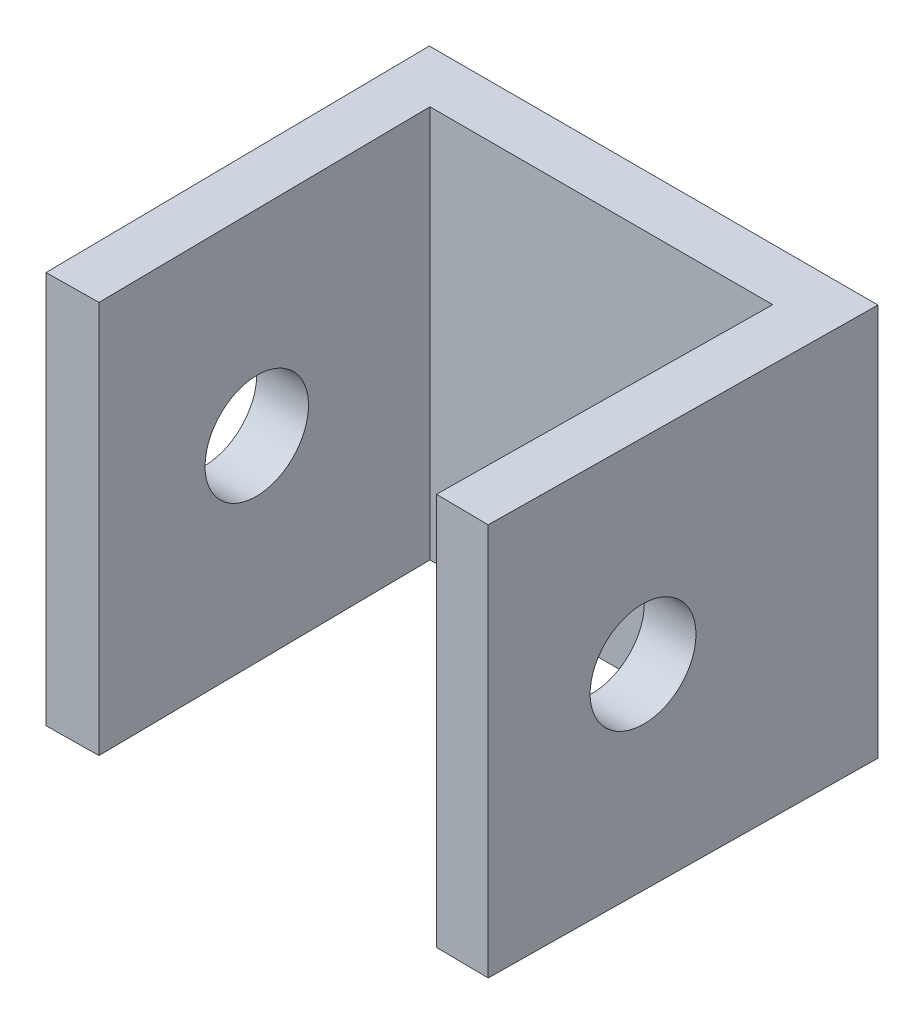
ISO-10303-21;
HEADER;
FILE_DESCRIPTION(('STEP AP214'),'2;1');
FILE_NAME('part.step','',(''),(''),'','','');
FILE_SCHEMA(('AUTOMOTIVE_DESIGN { 1 0 10303 214 1 1 1 1 }'));
ENDSEC;
DATA;
#1=APPLICATION_CONTEXT('core data for automotive mechanical design processes');
#2=APPLICATION_PROTOCOL_DEFINITION('international standard','automotive_design',2000,#1);
#3=PRODUCT_CONTEXT('',#1,'mechanical');
#4=PRODUCT('Part','Part','',(#3));
#5=PRODUCT_RELATED_PRODUCT_CATEGORY('part','',(#4));
#6=PRODUCT_DEFINITION_FORMATION('','',#4);
#7=PRODUCT_DEFINITION_CONTEXT('part definition',#1,'design');
#8=PRODUCT_DEFINITION('design','',#6,#7);
#9=PRODUCT_DEFINITION_SHAPE('','',#8);
#10=(LENGTH_UNIT() NAMED_UNIT(*) SI_UNIT(.MILLI.,.METRE.));
#11=(NAMED_UNIT(*) PLANE_ANGLE_UNIT() SI_UNIT($,.RADIAN.));
#12=(NAMED_UNIT(*) SI_UNIT($,.STERADIAN.) SOLID_ANGLE_UNIT());
#13=UNCERTAINTY_MEASURE_WITH_UNIT(LENGTH_MEASURE(1.E-05),#10,'distance_accuracy_value','');
#14=(GEOMETRIC_REPRESENTATION_CONTEXT(3) GLOBAL_UNCERTAINTY_ASSIGNED_CONTEXT((#13)) GLOBAL_UNIT_ASSIGNED_CONTEXT((#10,
#11,#12)) REPRESENTATION_CONTEXT('',''));
#15=CARTESIAN_POINT('',(0.,0.,0.));
#16=DIRECTION('',(0.,0.,1.));
#17=DIRECTION('',(1.,0.,0.));
#18=AXIS2_PLACEMENT_3D('',#15,#16,#17);
#19=CARTESIAN_POINT('',(0.,30.,0.));
#20=DIRECTION('',(0.,1.,0.));
#21=DIRECTION('',(0.,0.,1.));
#22=AXIS2_PLACEMENT_3D('',#19,#20,#21);
#23=PLANE('',#22);
#24=DIRECTION('',(-1.,0.,0.));
#25=VECTOR('',#24,1.);
#26=CARTESIAN_POINT('',(-17.1471496487741,30.,-16.8));
#27=LINE('',#26,#25);
#28=CARTESIAN_POINT('',(17.1475230853167,30.,-16.8));
#29=VERTEX_POINT('',#28);
#30=CARTESIAN_POINT('',(-17.1471496487741,30.,-16.8));
#31=VERTEX_POINT('',#30);
#32=EDGE_CURVE('E120',#29,#31,#27,.T.);
#33=ORIENTED_EDGE('',*,*,#32,.T.);
#34=DIRECTION('',(0.0117179454201639,0.,0.99993134252064));
#35=VECTOR('',#34,1.);
#36=CARTESIAN_POINT('',(-16.7997253700826,30.,12.8468717816807));
#37=LINE('',#36,#35);
#38=CARTESIAN_POINT('',(-16.7997253700826,30.,12.8468717816807));
#39=VERTEX_POINT('',#38);
#40=EDGE_CURVE('E51',#31,#39,#37,.T.);
#41=ORIENTED_EDGE('',*,*,#40,.T.);
#42=DIRECTION('',(0.999931342520641,0.,-0.0117179454201641));
#43=VECTOR('',#42,1.);
#44=CARTESIAN_POINT('',(-16.7997253700826,30.,12.8468717816807));
#45=LINE('',#44,#43);
#46=CARTESIAN_POINT('',(-12.8,30.,12.8));
#47=VERTEX_POINT('',#46);
#48=EDGE_CURVE('E144',#39,#47,#45,.T.);
#49=ORIENTED_EDGE('',*,*,#48,.T.);
#50=DIRECTION('',(-0.0117179454201639,0.,-0.99993134252064));
#51=VECTOR('',#50,1.);
#52=CARTESIAN_POINT('',(-12.8,30.,12.8));
#53=LINE('',#52,#51);
#54=CARTESIAN_POINT('',(-13.1,30.,-12.8));
#55=VERTEX_POINT('',#54);
#56=EDGE_CURVE('E91',#47,#55,#53,.T.);
#57=ORIENTED_EDGE('',*,*,#56,.T.);
#58=DIRECTION('',(1.,0.,0.));
#59=VECTOR('',#58,1.);
#60=CARTESIAN_POINT('',(-13.1,30.,-12.8));
#61=LINE('',#60,#59);
#62=CARTESIAN_POINT('',(13.1,30.,-12.8));
#63=VERTEX_POINT('',#62);
#64=EDGE_CURVE('E160',#55,#63,#61,.T.);
#65=ORIENTED_EDGE('',*,*,#64,.T.);
#66=DIRECTION('',(-0.0118101998876842,0.,0.999930257157274));
#67=VECTOR('',#66,1.);
#68=CARTESIAN_POINT('',(13.1,30.,-12.8));
#69=LINE('',#68,#67);
#70=CARTESIAN_POINT('',(12.8,30.,12.6));
#71=VERTEX_POINT('',#70);
#72=EDGE_CURVE('E106',#63,#71,#69,.T.);
#73=ORIENTED_EDGE('',*,*,#72,.T.);
#74=DIRECTION('',(0.999930257157274,0.,0.0118101998876842));
#75=VECTOR('',#74,1.);
#76=CARTESIAN_POINT('',(12.8,30.,12.6));
#77=LINE('',#76,#75);
#78=CARTESIAN_POINT('',(16.7997210286291,30.,12.6472407995507));
#79=VERTEX_POINT('',#78);
#80=EDGE_CURVE('E101',#71,#79,#77,.T.);
#81=ORIENTED_EDGE('',*,*,#80,.T.);
#82=DIRECTION('',(0.0118101998876842,0.,-0.999930257157274));
#83=VECTOR('',#82,1.);
#84=CARTESIAN_POINT('',(17.1475230853167,30.,-16.8));
#85=LINE('',#84,#83);
#86=EDGE_CURVE('E104',#79,#29,#85,.T.);
#87=ORIENTED_EDGE('',*,*,#86,.T.);
#88=EDGE_LOOP('',(#33,#41,#49,#57,#65,#73,#81,#87));
#89=FACE_BOUND('',#88,.T.);
#90=ADVANCED_FACE('F33',(#89),#23,.T.);
#91=CARTESIAN_POINT('',(0.,0.,0.));
#92=DIRECTION('',(0.,1.,0.));
#93=DIRECTION('',(0.,0.,1.));
#94=AXIS2_PLACEMENT_3D('',#91,#92,#93);
#95=PLANE('',#94);
#96=DIRECTION('',(0.999930257157274,0.,0.0118101998876842));
#97=VECTOR('',#96,1.);
#98=CARTESIAN_POINT('',(12.8,0.,12.6));
#99=LINE('',#98,#97);
#100=CARTESIAN_POINT('',(12.8,0.,12.6));
#101=VERTEX_POINT('',#100);
#102=CARTESIAN_POINT('',(16.7997210286291,0.,12.6472407995507));
#103=VERTEX_POINT('',#102);
#104=EDGE_CURVE('E114',#101,#103,#99,.T.);
#105=ORIENTED_EDGE('',*,*,#104,.F.);
#106=DIRECTION('',(-0.0118101998876842,0.,0.999930257157274));
#107=VECTOR('',#106,1.);
#108=CARTESIAN_POINT('',(13.1,0.,-12.8));
#109=LINE('',#108,#107);
#110=CARTESIAN_POINT('',(13.1,0.,-12.8));
#111=VERTEX_POINT('',#110);
#112=EDGE_CURVE('E136',#111,#101,#109,.T.);
#113=ORIENTED_EDGE('',*,*,#112,.F.);
#114=DIRECTION('',(1.,0.,0.));
#115=VECTOR('',#114,1.);
#116=CARTESIAN_POINT('',(-13.1,0.,-12.8));
#117=LINE('',#116,#115);
#118=CARTESIAN_POINT('',(-13.1,0.,-12.8));
#119=VERTEX_POINT('',#118);
#120=EDGE_CURVE('E134',#119,#111,#117,.T.);
#121=ORIENTED_EDGE('',*,*,#120,.F.);
#122=DIRECTION('',(-0.0117179454201639,0.,-0.99993134252064));
#123=VECTOR('',#122,1.);
#124=CARTESIAN_POINT('',(-12.8,0.,12.8));
#125=LINE('',#124,#123);
#126=CARTESIAN_POINT('',(-12.8,0.,12.8));
#127=VERTEX_POINT('',#126);
#128=EDGE_CURVE('E130',#127,#119,#125,.T.);
#129=ORIENTED_EDGE('',*,*,#128,.F.);
#130=DIRECTION('',(0.999931342520641,0.,-0.0117179454201641));
#131=VECTOR('',#130,1.);
#132=CARTESIAN_POINT('',(-16.7997253700826,0.,12.8468717816807));
#133=LINE('',#132,#131);
#134=CARTESIAN_POINT('',(-16.7997253700826,0.,12.8468717816807));
#135=VERTEX_POINT('',#134);
#136=EDGE_CURVE('E127',#135,#127,#133,.T.);
#137=ORIENTED_EDGE('',*,*,#136,.F.);
#138=DIRECTION('',(0.0117179454201639,0.,0.99993134252064));
#139=VECTOR('',#138,1.);
#140=CARTESIAN_POINT('',(-16.7997253700826,0.,12.8468717816807));
#141=LINE('',#140,#139);
#142=CARTESIAN_POINT('',(-17.1471496487741,0.,-16.8));
#143=VERTEX_POINT('',#142);
#144=EDGE_CURVE('E83',#143,#135,#141,.T.);
#145=ORIENTED_EDGE('',*,*,#144,.F.);
#146=DIRECTION('',(-1.,0.,0.));
#147=VECTOR('',#146,1.);
#148=CARTESIAN_POINT('',(-17.1471496487741,0.,-16.8));
#149=LINE('',#148,#147);
#150=CARTESIAN_POINT('',(17.1475230853167,0.,-16.8));
#151=VERTEX_POINT('',#150);
#152=EDGE_CURVE('E140',#151,#143,#149,.T.);
#153=ORIENTED_EDGE('',*,*,#152,.F.);
#154=DIRECTION('',(0.0118101998876842,0.,-0.999930257157274));
#155=VECTOR('',#154,1.);
#156=CARTESIAN_POINT('',(17.1475230853167,0.,-16.8));
#157=LINE('',#156,#155);
#158=EDGE_CURVE('E76',#103,#151,#157,.T.);
#159=ORIENTED_EDGE('',*,*,#158,.F.);
#160=EDGE_LOOP('',(#105,#113,#121,#129,#137,#145,#153,#159));
#161=FACE_BOUND('',#160,.T.);
#162=ADVANCED_FACE('F169',(#161),#95,.F.);
#163=CARTESIAN_POINT('',(-16.7997253700826,30.,12.8468717816807));
#164=DIRECTION('',(-0.0117179454201641,0.,-0.99993134252064));
#165=DIRECTION('',(-0.99993134252064,0.,0.0117179454201641));
#166=AXIS2_PLACEMENT_3D('',#163,#164,#165);
#167=PLANE('',#166);
#168=ORIENTED_EDGE('',*,*,#136,.T.);
#169=DIRECTION('',(0.,-1.,0.));
#170=VECTOR('',#169,1.);
#171=CARTESIAN_POINT('',(-12.8,30.,12.8));
#172=LINE('',#171,#170);
#173=EDGE_CURVE('E11',#47,#127,#172,.T.);
#174=ORIENTED_EDGE('',*,*,#173,.F.);
#175=ORIENTED_EDGE('',*,*,#48,.F.);
#176=DIRECTION('',(0.,-1.,0.));
#177=VECTOR('',#176,1.);
#178=CARTESIAN_POINT('',(-16.7997253700826,30.,12.8468717816807));
#179=LINE('',#178,#177);
#180=EDGE_CURVE('E126',#39,#135,#179,.T.);
#181=ORIENTED_EDGE('',*,*,#180,.T.);
#182=EDGE_LOOP('',(#168,#174,#175,#181));
#183=FACE_BOUND('',#182,.T.);
#184=ADVANCED_FACE('F35',(#183),#167,.F.);
#185=CARTESIAN_POINT('',(-12.8,30.,12.8));
#186=DIRECTION('',(-0.99993134252064,0.,0.0117179454201639));
#187=DIRECTION('',(0.0117179454201639,0.,0.99993134252064));
#188=AXIS2_PLACEMENT_3D('',#185,#186,#187);
#189=PLANE('',#188);
#190=CARTESIAN_POINT('',(-12.9430257914129,15.,0.595132466101247));
#191=DIRECTION('',(-0.99993134252064,0.,0.0117179454201639));
#192=DIRECTION('',(0.0117179454201639,0.,0.99993134252064));
#193=AXIS2_PLACEMENT_3D('',#190,#191,#192);
#194=ELLIPSE('',#193,4.00110745377421,4.);
#195=CARTESIAN_POINT('',(-12.8961410326493,15.,4.59596521392304));
#196=VERTEX_POINT('',#195);
#197=EDGE_CURVE('E131',#196,#196,#194,.T.);
#198=ORIENTED_EDGE('',*,*,#197,.T.);
#199=EDGE_LOOP('',(#198));
#200=FACE_BOUND('',#199,.T.);
#201=ORIENTED_EDGE('',*,*,#128,.T.);
#202=DIRECTION('',(0.,-1.,0.));
#203=VECTOR('',#202,1.);
#204=CARTESIAN_POINT('',(-13.1,30.,-12.8));
#205=LINE('',#204,#203);
#206=EDGE_CURVE('E43',#55,#119,#205,.T.);
#207=ORIENTED_EDGE('',*,*,#206,.F.);
#208=ORIENTED_EDGE('',*,*,#56,.F.);
#209=ORIENTED_EDGE('',*,*,#173,.T.);
#210=EDGE_LOOP('',(#201,#207,#208,#209));
#211=FACE_BOUND('',#210,.T.);
#212=ADVANCED_FACE('F161',(#200,#211),#189,.F.);
#213=CARTESIAN_POINT('',(-13.1,30.,-12.8));
#214=DIRECTION('',(0.,0.,-1.));
#215=DIRECTION('',(-1.,0.,0.));
#216=AXIS2_PLACEMENT_3D('',#213,#214,#215);
#217=PLANE('',#216);
#218=ORIENTED_EDGE('',*,*,#64,.F.);
#219=ORIENTED_EDGE('',*,*,#206,.T.);
#220=ORIENTED_EDGE('',*,*,#120,.T.);
#221=DIRECTION('',(0.,-1.,0.));
#222=VECTOR('',#221,1.);
#223=CARTESIAN_POINT('',(13.1,30.,-12.8));
#224=LINE('',#223,#222);
#225=EDGE_CURVE('E150',#63,#111,#224,.T.);
#226=ORIENTED_EDGE('',*,*,#225,.F.);
#227=EDGE_LOOP('',(#218,#219,#220,#226));
#228=FACE_BOUND('',#227,.T.);
#229=ADVANCED_FACE('F156',(#228),#217,.F.);
#230=CARTESIAN_POINT('',(13.1,30.,-12.8));
#231=DIRECTION('',(0.999930257157274,0.,0.0118101998876842));
#232=DIRECTION('',(0.0118101998876842,0.,-0.999930257157275));
#233=AXIS2_PLACEMENT_3D('',#230,#231,#232);
#234=PLANE('',#233);
#235=CARTESIAN_POINT('',(12.9381793386859,15.,0.900815991259892));
#236=DIRECTION('',(0.999930257157274,0.,0.0118101998876842));
#237=DIRECTION('',(0.0118101998876842,0.,-0.999930257157275));
#238=AXIS2_PLACEMENT_3D('',#235,#236,#237);
#239=CIRCLE('',#238,4.);
#240=CARTESIAN_POINT('',(12.9854201382366,15.,-3.09890503736921));
#241=VERTEX_POINT('',#240);
#242=EDGE_CURVE('E220',#241,#241,#239,.T.);
#243=ORIENTED_EDGE('',*,*,#242,.T.);
#244=EDGE_LOOP('',(#243));
#245=FACE_BOUND('',#244,.T.);
#246=ORIENTED_EDGE('',*,*,#112,.T.);
#247=DIRECTION('',(0.,-1.,0.));
#248=VECTOR('',#247,1.);
#249=CARTESIAN_POINT('',(12.8,30.,12.6));
#250=LINE('',#249,#248);
#251=EDGE_CURVE('E115',#71,#101,#250,.T.);
#252=ORIENTED_EDGE('',*,*,#251,.F.);
#253=ORIENTED_EDGE('',*,*,#72,.F.);
#254=ORIENTED_EDGE('',*,*,#225,.T.);
#255=EDGE_LOOP('',(#246,#252,#253,#254));
#256=FACE_BOUND('',#255,.T.);
#257=ADVANCED_FACE('F185',(#245,#256),#234,.F.);
#258=CARTESIAN_POINT('',(12.8,30.,12.6));
#259=DIRECTION('',(0.0118101998876842,0.,-0.999930257157274));
#260=DIRECTION('',(-0.999930257157275,0.,-0.0118101998876842));
#261=AXIS2_PLACEMENT_3D('',#258,#259,#260);
#262=PLANE('',#261);
#263=ORIENTED_EDGE('',*,*,#104,.T.);
#264=DIRECTION('',(0.,-1.,0.));
#265=VECTOR('',#264,1.);
#266=CARTESIAN_POINT('',(16.7997210286291,30.,12.6472407995507));
#267=LINE('',#266,#265);
#268=EDGE_CURVE('E111',#79,#103,#267,.T.);
#269=ORIENTED_EDGE('',*,*,#268,.F.);
#270=ORIENTED_EDGE('',*,*,#80,.F.);
#271=ORIENTED_EDGE('',*,*,#251,.T.);
#272=EDGE_LOOP('',(#263,#269,#270,#271));
#273=FACE_BOUND('',#272,.T.);
#274=ADVANCED_FACE('F112',(#273),#262,.F.);
#275=CARTESIAN_POINT('',(17.1475230853167,30.,-16.8));
#276=DIRECTION('',(-0.999930257157274,0.,-0.0118101998876842));
#277=DIRECTION('',(-0.0118101998876842,0.,0.999930257157275));
#278=AXIS2_PLACEMENT_3D('',#275,#276,#277);
#279=PLANE('',#278);
#280=CARTESIAN_POINT('',(16.937900367315,15.,0.948056790810628));
#281=DIRECTION('',(0.999930257157274,0.,0.0118101998876842));
#282=DIRECTION('',(0.0118101998876842,0.,-0.999930257157274));
#283=AXIS2_PLACEMENT_3D('',#280,#281,#282);
#284=CIRCLE('',#283,4.);
#285=CARTESIAN_POINT('',(16.9851411668657,15.,-3.05166423781847));
#286=VERTEX_POINT('',#285);
#287=EDGE_CURVE('E216',#286,#286,#284,.T.);
#288=ORIENTED_EDGE('',*,*,#287,.F.);
#289=EDGE_LOOP('',(#288));
#290=FACE_BOUND('',#289,.T.);
#291=ORIENTED_EDGE('',*,*,#158,.T.);
#292=DIRECTION('',(0.,-1.,0.));
#293=VECTOR('',#292,1.);
#294=CARTESIAN_POINT('',(17.1475230853167,30.,-16.8));
#295=LINE('',#294,#293);
#296=EDGE_CURVE('E116',#29,#151,#295,.T.);
#297=ORIENTED_EDGE('',*,*,#296,.F.);
#298=ORIENTED_EDGE('',*,*,#86,.F.);
#299=ORIENTED_EDGE('',*,*,#268,.T.);
#300=EDGE_LOOP('',(#291,#297,#298,#299));
#301=FACE_BOUND('',#300,.T.);
#302=ADVANCED_FACE('F118',(#290,#301),#279,.F.);
#303=CARTESIAN_POINT('',(-17.1471496487741,30.,-16.8));
#304=DIRECTION('',(0.,0.,1.));
#305=DIRECTION('',(1.,0.,0.));
#306=AXIS2_PLACEMENT_3D('',#303,#304,#305);
#307=PLANE('',#306);
#308=DIRECTION('',(0.,-1.,0.));
#309=VECTOR('',#308,1.);
#310=CARTESIAN_POINT('',(-17.1471496487741,30.,-16.8));
#311=LINE('',#310,#309);
#312=EDGE_CURVE('E146',#31,#143,#311,.T.);
#313=ORIENTED_EDGE('',*,*,#312,.F.);
#314=ORIENTED_EDGE('',*,*,#32,.F.);
#315=ORIENTED_EDGE('',*,*,#296,.T.);
#316=ORIENTED_EDGE('',*,*,#152,.T.);
#317=EDGE_LOOP('',(#313,#314,#315,#316));
#318=FACE_BOUND('',#317,.T.);
#319=ADVANCED_FACE('F172',(#318),#307,.F.);
#320=CARTESIAN_POINT('',(-16.7997253700826,30.,12.8468717816807));
#321=DIRECTION('',(0.99993134252064,0.,-0.0117179454201639));
#322=DIRECTION('',(-0.0117179454201639,0.,-0.99993134252064));
#323=AXIS2_PLACEMENT_3D('',#320,#321,#322);
#324=PLANE('',#323);
#325=ORIENTED_EDGE('',*,*,#40,.F.);
#326=ORIENTED_EDGE('',*,*,#312,.T.);
#327=ORIENTED_EDGE('',*,*,#144,.T.);
#328=ORIENTED_EDGE('',*,*,#180,.F.);
#329=EDGE_LOOP('',(#325,#326,#327,#328));
#330=FACE_BOUND('',#329,.T.);
#331=CARTESIAN_POINT('',(-16.9438541965792,15.,0.547878587300071));
#332=DIRECTION('',(0.99993134252064,0.,-0.0117179454201639));
#333=DIRECTION('',(0.0117179454201639,0.,0.99993134252064));
#334=AXIS2_PLACEMENT_3D('',#331,#332,#333);
#335=ELLIPSE('',#334,4.00110745377421,4.);
#336=CARTESIAN_POINT('',(-16.8969694378157,15.,4.54871133512186));
#337=VERTEX_POINT('',#336);
#338=EDGE_CURVE('E37',#337,#337,#335,.T.);
#339=ORIENTED_EDGE('',*,*,#338,.T.);
#340=EDGE_LOOP('',(#339));
#341=FACE_BOUND('',#340,.T.);
#342=ADVANCED_FACE('F173',(#330,#341),#324,.F.);
#343=CARTESIAN_POINT('',(-23.059309918976,15.,0.475648795303259));
#344=DIRECTION('',(0.999930257157274,0.,0.0118101998876842));
#345=DIRECTION('',(0.0118101998876842,0.,-0.999930257157275));
#346=AXIS2_PLACEMENT_3D('',#343,#344,#345);
#347=CYLINDRICAL_SURFACE('',#346,4.);
#348=ORIENTED_EDGE('',*,*,#338,.F.);
#349=EDGE_LOOP('',(#348));
#350=FACE_BOUND('',#349,.T.);
#351=ORIENTED_EDGE('',*,*,#197,.F.);
#352=EDGE_LOOP('',(#351));
#353=FACE_BOUND('',#352,.T.);
#354=ADVANCED_FACE('F205',(#350,#353),#347,.F.);
#355=ORIENTED_EDGE('',*,*,#287,.T.);
#356=EDGE_LOOP('',(#355));
#357=FACE_BOUND('',#356,.T.);
#358=ORIENTED_EDGE('',*,*,#242,.F.);
#359=EDGE_LOOP('',(#358));
#360=FACE_BOUND('',#359,.T.);
#361=ADVANCED_FACE('F227',(#357,#360),#347,.F.);
#362=CLOSED_SHELL('',(#90,#162,#184,#212,#229,#257,#274,#302,#319,#342,#354,#361));
#363=MANIFOLD_SOLID_BREP('B2',#362);
#364=ADVANCED_BREP_SHAPE_REPRESENTATION('',(#18,#363),#14);
#365=SHAPE_DEFINITION_REPRESENTATION(#9,#364);
ENDSEC;
END-ISO-10303-21;
